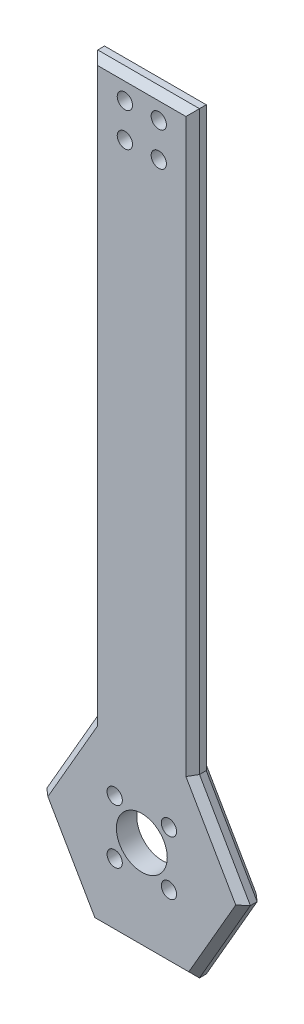
ISO-10303-21;
HEADER;
FILE_DESCRIPTION(('STEP AP214'),'2;1');
FILE_NAME('part.step','',(''),(''),'','','');
FILE_SCHEMA(('AUTOMOTIVE_DESIGN { 1 0 10303 214 1 1 1 1 }'));
ENDSEC;
DATA;
#1=APPLICATION_CONTEXT('core data for automotive mechanical design processes');
#2=APPLICATION_PROTOCOL_DEFINITION('international standard','automotive_design',2000,#1);
#3=PRODUCT_CONTEXT('',#1,'mechanical');
#4=PRODUCT('Part','Part','',(#3));
#5=PRODUCT_RELATED_PRODUCT_CATEGORY('part','',(#4));
#6=PRODUCT_DEFINITION_FORMATION('','',#4);
#7=PRODUCT_DEFINITION_CONTEXT('part definition',#1,'design');
#8=PRODUCT_DEFINITION('design','',#6,#7);
#9=PRODUCT_DEFINITION_SHAPE('','',#8);
#10=(LENGTH_UNIT() NAMED_UNIT(*) SI_UNIT(.MILLI.,.METRE.));
#11=(NAMED_UNIT(*) PLANE_ANGLE_UNIT() SI_UNIT($,.RADIAN.));
#12=(NAMED_UNIT(*) SI_UNIT($,.STERADIAN.) SOLID_ANGLE_UNIT());
#13=UNCERTAINTY_MEASURE_WITH_UNIT(LENGTH_MEASURE(1.E-05),#10,'distance_accuracy_value','');
#14=(GEOMETRIC_REPRESENTATION_CONTEXT(3) GLOBAL_UNCERTAINTY_ASSIGNED_CONTEXT((#13)) GLOBAL_UNIT_ASSIGNED_CONTEXT((#10,
#11,#12)) REPRESENTATION_CONTEXT('',''));
#15=CARTESIAN_POINT('',(0.,0.,0.));
#16=DIRECTION('',(0.,0.,1.));
#17=DIRECTION('',(1.,0.,0.));
#18=AXIS2_PLACEMENT_3D('',#15,#16,#17);
#19=CARTESIAN_POINT('',(0.,0.,0.));
#20=DIRECTION('',(0.,0.,-1.));
#21=DIRECTION('',(-1.,0.,0.));
#22=AXIS2_PLACEMENT_3D('',#19,#20,#21);
#23=PLANE('',#22);
#24=DIRECTION('',(0.5,0.866025403784439,0.));
#25=VECTOR('',#24,1.);
#26=CARTESIAN_POINT('',(27.2881304684075,-15.7548094716167,0.));
#27=LINE('',#26,#25);
#28=CARTESIAN_POINT('',(-27.6905989232415,-110.980762113533,0.));
#29=VERTEX_POINT('',#28);
#30=CARTESIAN_POINT('',(-13.,-85.5358983848622,0.));
#31=VERTEX_POINT('',#30);
#32=EDGE_CURVE('E214',#29,#31,#27,.T.);
#33=ORIENTED_EDGE('',*,*,#32,.T.);
#34=DIRECTION('',(0.,1.,0.));
#35=VECTOR('',#34,1.);
#36=CARTESIAN_POINT('',(-13.,85.,0.));
#37=LINE('',#36,#35);
#38=CARTESIAN_POINT('',(-13.,83.,0.));
#39=VERTEX_POINT('',#38);
#40=EDGE_CURVE('E169',#31,#39,#37,.T.);
#41=ORIENTED_EDGE('',*,*,#40,.T.);
#42=DIRECTION('',(1.,0.,0.));
#43=VECTOR('',#42,1.);
#44=CARTESIAN_POINT('',(15.,83.,0.));
#45=LINE('',#44,#43);
#46=CARTESIAN_POINT('',(13.,83.,0.));
#47=VERTEX_POINT('',#46);
#48=EDGE_CURVE('E199',#39,#47,#45,.T.);
#49=ORIENTED_EDGE('',*,*,#48,.T.);
#50=DIRECTION('',(0.,-1.,0.));
#51=VECTOR('',#50,1.);
#52=CARTESIAN_POINT('',(13.,-85.,0.));
#53=LINE('',#52,#51);
#54=CARTESIAN_POINT('',(13.,-85.5358983848623,0.));
#55=VERTEX_POINT('',#54);
#56=EDGE_CURVE('E204',#47,#55,#53,.T.);
#57=ORIENTED_EDGE('',*,*,#56,.T.);
#58=DIRECTION('',(0.5,-0.866025403784439,0.));
#59=VECTOR('',#58,1.);
#60=CARTESIAN_POINT('',(-27.2881304684075,-15.7548094716167,0.));
#61=LINE('',#60,#59);
#62=CARTESIAN_POINT('',(27.6905989232415,-110.980762113533,0.));
#63=VERTEX_POINT('',#62);
#64=EDGE_CURVE('E206',#55,#63,#61,.T.);
#65=ORIENTED_EDGE('',*,*,#64,.T.);
#66=DIRECTION('',(-0.5,-0.866025403784439,0.));
#67=VECTOR('',#66,1.);
#68=CARTESIAN_POINT('',(68.8240288532697,-39.7355715851498,0.));
#69=LINE('',#68,#67);
#70=CARTESIAN_POINT('',(13.8452994616207,-134.961524227066,0.));
#71=VERTEX_POINT('',#70);
#72=EDGE_CURVE('E208',#63,#71,#69,.T.);
#73=ORIENTED_EDGE('',*,*,#72,.T.);
#74=DIRECTION('',(-1.,0.,0.));
#75=VECTOR('',#74,1.);
#76=CARTESIAN_POINT('',(0.,-134.961524227066,0.));
#77=LINE('',#76,#75);
#78=CARTESIAN_POINT('',(-13.8452994616208,-134.961524227066,0.));
#79=VERTEX_POINT('',#78);
#80=EDGE_CURVE('E210',#71,#79,#77,.T.);
#81=ORIENTED_EDGE('',*,*,#80,.T.);
#82=DIRECTION('',(-0.5,0.866025403784439,0.));
#83=VECTOR('',#82,1.);
#84=CARTESIAN_POINT('',(-68.8240288532698,-39.7355715851499,0.));
#85=LINE('',#84,#83);
#86=EDGE_CURVE('E212',#79,#29,#85,.T.);
#87=ORIENTED_EDGE('',*,*,#86,.T.);
#88=EDGE_LOOP('',(#33,#41,#49,#57,#65,#73,#81,#87));
#89=FACE_BOUND('',#88,.T.);
#90=CARTESIAN_POINT('',(-8.,-100.961524227066,0.));
#91=DIRECTION('',(0.,0.,-1.));
#92=DIRECTION('',(-1.,0.,0.));
#93=AXIS2_PLACEMENT_3D('',#90,#91,#92);
#94=CIRCLE('',#93,2.25000000000001);
#95=CARTESIAN_POINT('',(-10.25,-100.961524227066,0.));
#96=VERTEX_POINT('',#95);
#97=EDGE_CURVE('E752',#96,#96,#94,.T.);
#98=ORIENTED_EDGE('',*,*,#97,.F.);
#99=EDGE_LOOP('',(#98));
#100=FACE_BOUND('',#99,.T.);
#101=CARTESIAN_POINT('',(8.,-100.961524227066,0.));
#102=DIRECTION('',(0.,0.,-1.));
#103=DIRECTION('',(-1.,0.,0.));
#104=AXIS2_PLACEMENT_3D('',#101,#102,#103);
#105=CIRCLE('',#104,2.25000000000001);
#106=CARTESIAN_POINT('',(5.74999999999998,-100.961524227066,0.));
#107=VERTEX_POINT('',#106);
#108=EDGE_CURVE('E746',#107,#107,#105,.T.);
#109=ORIENTED_EDGE('',*,*,#108,.F.);
#110=EDGE_LOOP('',(#109));
#111=FACE_BOUND('',#110,.T.);
#112=CARTESIAN_POINT('',(8.,-116.961524227066,0.));
#113=DIRECTION('',(0.,0.,-1.));
#114=DIRECTION('',(-1.,0.,0.));
#115=AXIS2_PLACEMENT_3D('',#112,#113,#114);
#116=CIRCLE('',#115,2.25000000000001);
#117=CARTESIAN_POINT('',(5.74999999999998,-116.961524227066,0.));
#118=VERTEX_POINT('',#117);
#119=EDGE_CURVE('E740',#118,#118,#116,.T.);
#120=ORIENTED_EDGE('',*,*,#119,.F.);
#121=EDGE_LOOP('',(#120));
#122=FACE_BOUND('',#121,.T.);
#123=CARTESIAN_POINT('',(-8.,-116.961524227066,0.));
#124=DIRECTION('',(0.,0.,-1.));
#125=DIRECTION('',(-1.,0.,0.));
#126=AXIS2_PLACEMENT_3D('',#123,#124,#125);
#127=CIRCLE('',#126,2.25000000000001);
#128=CARTESIAN_POINT('',(-10.25,-116.961524227066,0.));
#129=VERTEX_POINT('',#128);
#130=EDGE_CURVE('E734',#129,#129,#127,.T.);
#131=ORIENTED_EDGE('',*,*,#130,.F.);
#132=EDGE_LOOP('',(#131));
#133=FACE_BOUND('',#132,.T.);
#134=CARTESIAN_POINT('',(-5.,78.,0.));
#135=DIRECTION('',(0.,0.,1.));
#136=DIRECTION('',(1.,0.,0.));
#137=AXIS2_PLACEMENT_3D('',#134,#135,#136);
#138=CIRCLE('',#137,2.25000000000001);
#139=CARTESIAN_POINT('',(-2.74999999999999,78.,0.));
#140=VERTEX_POINT('',#139);
#141=EDGE_CURVE('E731',#140,#140,#138,.T.);
#142=ORIENTED_EDGE('',*,*,#141,.T.);
#143=EDGE_LOOP('',(#142));
#144=FACE_BOUND('',#143,.T.);
#145=CARTESIAN_POINT('',(5.,78.,0.));
#146=DIRECTION('',(0.,0.,1.));
#147=DIRECTION('',(1.,0.,0.));
#148=AXIS2_PLACEMENT_3D('',#145,#146,#147);
#149=CIRCLE('',#148,2.25000000000001);
#150=CARTESIAN_POINT('',(7.25000000000001,78.,0.));
#151=VERTEX_POINT('',#150);
#152=EDGE_CURVE('E725',#151,#151,#149,.T.);
#153=ORIENTED_EDGE('',*,*,#152,.T.);
#154=EDGE_LOOP('',(#153));
#155=FACE_BOUND('',#154,.T.);
#156=CARTESIAN_POINT('',(5.,68.,0.));
#157=DIRECTION('',(0.,0.,1.));
#158=DIRECTION('',(1.,0.,0.));
#159=AXIS2_PLACEMENT_3D('',#156,#157,#158);
#160=CIRCLE('',#159,2.25000000000001);
#161=CARTESIAN_POINT('',(7.25000000000001,68.,0.));
#162=VERTEX_POINT('',#161);
#163=EDGE_CURVE('E719',#162,#162,#160,.T.);
#164=ORIENTED_EDGE('',*,*,#163,.T.);
#165=EDGE_LOOP('',(#164));
#166=FACE_BOUND('',#165,.T.);
#167=CARTESIAN_POINT('',(-5.,68.,0.));
#168=DIRECTION('',(0.,0.,1.));
#169=DIRECTION('',(1.,0.,0.));
#170=AXIS2_PLACEMENT_3D('',#167,#168,#169);
#171=CIRCLE('',#170,2.25000000000001);
#172=CARTESIAN_POINT('',(-2.74999999999999,68.,0.));
#173=VERTEX_POINT('',#172);
#174=EDGE_CURVE('E713',#173,#173,#171,.T.);
#175=ORIENTED_EDGE('',*,*,#174,.T.);
#176=EDGE_LOOP('',(#175));
#177=FACE_BOUND('',#176,.T.);
#178=CARTESIAN_POINT('',(-1.16226472890446E-13,-108.961524227066,0.));
#179=DIRECTION('',(0.,0.,1.));
#180=DIRECTION('',(1.,0.,0.));
#181=AXIS2_PLACEMENT_3D('',#178,#179,#180);
#182=CIRCLE('',#181,7.50000000000001);
#183=CARTESIAN_POINT('',(7.4999999999999,-108.961524227066,0.));
#184=VERTEX_POINT('',#183);
#185=EDGE_CURVE('E704',#184,#184,#182,.T.);
#186=ORIENTED_EDGE('',*,*,#185,.T.);
#187=EDGE_LOOP('',(#186));
#188=FACE_BOUND('',#187,.T.);
#189=ADVANCED_FACE('F43',(#89,#100,#111,#122,#133,#144,#155,#166,#177,#188),#23,.T.);
#190=CARTESIAN_POINT('',(15.,85.,6.));
#191=DIRECTION('',(0.,-1.,0.));
#192=DIRECTION('',(0.,0.,-1.));
#193=AXIS2_PLACEMENT_3D('',#190,#191,#192);
#194=PLANE('',#193);
#195=DIRECTION('',(0.,0.,-1.));
#196=VECTOR('',#195,1.);
#197=CARTESIAN_POINT('',(15.,85.,6.));
#198=LINE('',#197,#196);
#199=CARTESIAN_POINT('',(15.,85.,4.));
#200=VERTEX_POINT('',#199);
#201=CARTESIAN_POINT('',(15.,85.,1.99999999999997));
#202=VERTEX_POINT('',#201);
#203=EDGE_CURVE('E313',#200,#202,#198,.T.);
#204=ORIENTED_EDGE('',*,*,#203,.T.);
#205=DIRECTION('',(-1.,0.,0.));
#206=VECTOR('',#205,1.);
#207=CARTESIAN_POINT('',(-15.,85.,1.99999999999997));
#208=LINE('',#207,#206);
#209=CARTESIAN_POINT('',(-15.,85.,1.99999999999997));
#210=VERTEX_POINT('',#209);
#211=EDGE_CURVE('E242',#202,#210,#208,.T.);
#212=ORIENTED_EDGE('',*,*,#211,.T.);
#213=DIRECTION('',(0.,0.,-1.));
#214=VECTOR('',#213,1.);
#215=CARTESIAN_POINT('',(-15.,85.,6.));
#216=LINE('',#215,#214);
#217=CARTESIAN_POINT('',(-15.,85.,4.));
#218=VERTEX_POINT('',#217);
#219=EDGE_CURVE('E180',#218,#210,#216,.T.);
#220=ORIENTED_EDGE('',*,*,#219,.F.);
#221=DIRECTION('',(1.,0.,0.));
#222=VECTOR('',#221,1.);
#223=CARTESIAN_POINT('',(15.,85.,4.));
#224=LINE('',#223,#222);
#225=EDGE_CURVE('E240',#218,#200,#224,.T.);
#226=ORIENTED_EDGE('',*,*,#225,.T.);
#227=EDGE_LOOP('',(#204,#212,#220,#226));
#228=FACE_BOUND('',#227,.T.);
#229=ADVANCED_FACE('F339',(#228),#194,.F.);
#230=CARTESIAN_POINT('',(-15.,-85.,6.));
#231=DIRECTION('',(1.,0.,0.));
#232=DIRECTION('',(0.,0.,-1.));
#233=AXIS2_PLACEMENT_3D('',#230,#231,#232);
#234=PLANE('',#233);
#235=ORIENTED_EDGE('',*,*,#219,.T.);
#236=DIRECTION('',(0.,-1.,0.));
#237=VECTOR('',#236,1.);
#238=CARTESIAN_POINT('',(-15.,-85.,1.99999999999997));
#239=LINE('',#238,#237);
#240=CARTESIAN_POINT('',(-15.,-85.,1.99999999999997));
#241=VERTEX_POINT('',#240);
#242=EDGE_CURVE('E179',#210,#241,#239,.T.);
#243=ORIENTED_EDGE('',*,*,#242,.T.);
#244=DIRECTION('',(0.,0.,-1.));
#245=VECTOR('',#244,1.);
#246=CARTESIAN_POINT('',(-15.,-85.,6.));
#247=LINE('',#246,#245);
#248=CARTESIAN_POINT('',(-15.,-85.,4.));
#249=VERTEX_POINT('',#248);
#250=EDGE_CURVE('E161',#249,#241,#247,.T.);
#251=ORIENTED_EDGE('',*,*,#250,.F.);
#252=DIRECTION('',(0.,1.,0.));
#253=VECTOR('',#252,1.);
#254=CARTESIAN_POINT('',(-15.,-85.,4.));
#255=LINE('',#254,#253);
#256=EDGE_CURVE('E176',#249,#218,#255,.T.);
#257=ORIENTED_EDGE('',*,*,#256,.T.);
#258=EDGE_LOOP('',(#235,#243,#251,#257));
#259=FACE_BOUND('',#258,.T.);
#260=ADVANCED_FACE('F174',(#259),#234,.F.);
#261=CARTESIAN_POINT('',(15.,-85.,6.));
#262=DIRECTION('',(-1.,0.,0.));
#263=DIRECTION('',(0.,0.,1.));
#264=AXIS2_PLACEMENT_3D('',#261,#262,#263);
#265=PLANE('',#264);
#266=DIRECTION('',(0.,0.,-1.));
#267=VECTOR('',#266,1.);
#268=CARTESIAN_POINT('',(15.,-85.,6.));
#269=LINE('',#268,#267);
#270=CARTESIAN_POINT('',(15.,-85.,4.));
#271=VERTEX_POINT('',#270);
#272=CARTESIAN_POINT('',(15.,-85.,1.99999999999997));
#273=VERTEX_POINT('',#272);
#274=EDGE_CURVE('E181',#271,#273,#269,.T.);
#275=ORIENTED_EDGE('',*,*,#274,.T.);
#276=DIRECTION('',(0.,1.,0.));
#277=VECTOR('',#276,1.);
#278=CARTESIAN_POINT('',(15.,85.,1.99999999999997));
#279=LINE('',#278,#277);
#280=EDGE_CURVE('E238',#273,#202,#279,.T.);
#281=ORIENTED_EDGE('',*,*,#280,.T.);
#282=ORIENTED_EDGE('',*,*,#203,.F.);
#283=DIRECTION('',(0.,-1.,0.));
#284=VECTOR('',#283,1.);
#285=CARTESIAN_POINT('',(15.,-85.,4.));
#286=LINE('',#285,#284);
#287=EDGE_CURVE('E235',#200,#271,#286,.T.);
#288=ORIENTED_EDGE('',*,*,#287,.T.);
#289=EDGE_LOOP('',(#275,#281,#282,#288));
#290=FACE_BOUND('',#289,.T.);
#291=ADVANCED_FACE('F320',(#290),#265,.F.);
#292=CARTESIAN_POINT('',(0.,0.,6.));
#293=DIRECTION('',(0.,0.,-1.));
#294=DIRECTION('',(-1.,0.,0.));
#295=AXIS2_PLACEMENT_3D('',#292,#293,#294);
#296=PLANE('',#295);
#297=CARTESIAN_POINT('',(-1.16226472890446E-13,-108.961524227066,6.));
#298=DIRECTION('',(0.,0.,1.));
#299=DIRECTION('',(1.,0.,0.));
#300=AXIS2_PLACEMENT_3D('',#297,#298,#299);
#301=CIRCLE('',#300,7.50000000000001);
#302=CARTESIAN_POINT('',(7.4999999999999,-108.961524227066,6.));
#303=VERTEX_POINT('',#302);
#304=EDGE_CURVE('E706',#303,#303,#301,.T.);
#305=ORIENTED_EDGE('',*,*,#304,.F.);
#306=EDGE_LOOP('',(#305));
#307=FACE_BOUND('',#306,.T.);
#308=CARTESIAN_POINT('',(-5.,68.,6.));
#309=DIRECTION('',(0.,0.,1.));
#310=DIRECTION('',(1.,0.,0.));
#311=AXIS2_PLACEMENT_3D('',#308,#309,#310);
#312=CIRCLE('',#311,2.25000000000001);
#313=CARTESIAN_POINT('',(-2.74999999999998,68.,6.));
#314=VERTEX_POINT('',#313);
#315=EDGE_CURVE('E708',#314,#314,#312,.T.);
#316=ORIENTED_EDGE('',*,*,#315,.F.);
#317=EDGE_LOOP('',(#316));
#318=FACE_BOUND('',#317,.T.);
#319=CARTESIAN_POINT('',(5.,68.,6.));
#320=DIRECTION('',(0.,0.,1.));
#321=DIRECTION('',(1.,0.,0.));
#322=AXIS2_PLACEMENT_3D('',#319,#320,#321);
#323=CIRCLE('',#322,2.25000000000001);
#324=CARTESIAN_POINT('',(7.25000000000001,68.,6.));
#325=VERTEX_POINT('',#324);
#326=EDGE_CURVE('E716',#325,#325,#323,.T.);
#327=ORIENTED_EDGE('',*,*,#326,.F.);
#328=EDGE_LOOP('',(#327));
#329=FACE_BOUND('',#328,.T.);
#330=CARTESIAN_POINT('',(5.,78.,6.));
#331=DIRECTION('',(0.,0.,1.));
#332=DIRECTION('',(1.,0.,0.));
#333=AXIS2_PLACEMENT_3D('',#330,#331,#332);
#334=CIRCLE('',#333,2.25000000000001);
#335=CARTESIAN_POINT('',(7.25000000000001,78.,6.));
#336=VERTEX_POINT('',#335);
#337=EDGE_CURVE('E722',#336,#336,#334,.T.);
#338=ORIENTED_EDGE('',*,*,#337,.F.);
#339=EDGE_LOOP('',(#338));
#340=FACE_BOUND('',#339,.T.);
#341=CARTESIAN_POINT('',(-5.,78.,6.));
#342=DIRECTION('',(0.,0.,1.));
#343=DIRECTION('',(1.,0.,0.));
#344=AXIS2_PLACEMENT_3D('',#341,#342,#343);
#345=CIRCLE('',#344,2.25000000000001);
#346=CARTESIAN_POINT('',(-2.74999999999998,78.,6.));
#347=VERTEX_POINT('',#346);
#348=EDGE_CURVE('E728',#347,#347,#345,.T.);
#349=ORIENTED_EDGE('',*,*,#348,.F.);
#350=EDGE_LOOP('',(#349));
#351=FACE_BOUND('',#350,.T.);
#352=CARTESIAN_POINT('',(-8.,-116.961524227066,6.));
#353=DIRECTION('',(0.,0.,-1.));
#354=DIRECTION('',(-1.,0.,0.));
#355=AXIS2_PLACEMENT_3D('',#352,#353,#354);
#356=CIRCLE('',#355,2.25000000000001);
#357=CARTESIAN_POINT('',(-10.25,-116.961524227066,6.));
#358=VERTEX_POINT('',#357);
#359=EDGE_CURVE('E737',#358,#358,#356,.T.);
#360=ORIENTED_EDGE('',*,*,#359,.T.);
#361=EDGE_LOOP('',(#360));
#362=FACE_BOUND('',#361,.T.);
#363=CARTESIAN_POINT('',(8.,-116.961524227066,6.));
#364=DIRECTION('',(0.,0.,-1.));
#365=DIRECTION('',(-1.,0.,0.));
#366=AXIS2_PLACEMENT_3D('',#363,#364,#365);
#367=CIRCLE('',#366,2.25000000000001);
#368=CARTESIAN_POINT('',(5.74999999999998,-116.961524227066,6.));
#369=VERTEX_POINT('',#368);
#370=EDGE_CURVE('E743',#369,#369,#367,.T.);
#371=ORIENTED_EDGE('',*,*,#370,.T.);
#372=EDGE_LOOP('',(#371));
#373=FACE_BOUND('',#372,.T.);
#374=CARTESIAN_POINT('',(8.,-100.961524227066,6.));
#375=DIRECTION('',(0.,0.,-1.));
#376=DIRECTION('',(-1.,0.,0.));
#377=AXIS2_PLACEMENT_3D('',#374,#375,#376);
#378=CIRCLE('',#377,2.25000000000001);
#379=CARTESIAN_POINT('',(5.74999999999998,-100.961524227066,6.));
#380=VERTEX_POINT('',#379);
#381=EDGE_CURVE('E749',#380,#380,#378,.T.);
#382=ORIENTED_EDGE('',*,*,#381,.T.);
#383=EDGE_LOOP('',(#382));
#384=FACE_BOUND('',#383,.T.);
#385=CARTESIAN_POINT('',(-8.,-100.961524227066,6.));
#386=DIRECTION('',(0.,0.,-1.));
#387=DIRECTION('',(-1.,0.,0.));
#388=AXIS2_PLACEMENT_3D('',#385,#386,#387);
#389=CIRCLE('',#388,2.25000000000001);
#390=CARTESIAN_POINT('',(-10.25,-100.961524227066,6.));
#391=VERTEX_POINT('',#390);
#392=EDGE_CURVE('E280',#391,#391,#389,.T.);
#393=ORIENTED_EDGE('',*,*,#392,.T.);
#394=EDGE_LOOP('',(#393));
#395=FACE_BOUND('',#394,.T.);
#396=DIRECTION('',(-0.5,0.866025403784439,0.));
#397=VECTOR('',#396,1.);
#398=CARTESIAN_POINT('',(13.2679491924311,-86.,6.));
#399=LINE('',#398,#397);
#400=CARTESIAN_POINT('',(27.6905989232415,-110.980762113533,6.));
#401=VERTEX_POINT('',#400);
#402=CARTESIAN_POINT('',(13.,-85.5358983848623,6.));
#403=VERTEX_POINT('',#402);
#404=EDGE_CURVE('E53',#401,#403,#399,.T.);
#405=ORIENTED_EDGE('',*,*,#404,.T.);
#406=DIRECTION('',(0.,1.,0.));
#407=VECTOR('',#406,1.);
#408=CARTESIAN_POINT('',(13.,0.,6.));
#409=LINE('',#408,#407);
#410=CARTESIAN_POINT('',(13.,83.,6.));
#411=VERTEX_POINT('',#410);
#412=EDGE_CURVE('E11',#403,#411,#409,.T.);
#413=ORIENTED_EDGE('',*,*,#412,.T.);
#414=DIRECTION('',(-1.,0.,0.));
#415=VECTOR('',#414,1.);
#416=CARTESIAN_POINT('',(0.,83.,6.));
#417=LINE('',#416,#415);
#418=CARTESIAN_POINT('',(-13.,83.,6.));
#419=VERTEX_POINT('',#418);
#420=EDGE_CURVE('E244',#411,#419,#417,.T.);
#421=ORIENTED_EDGE('',*,*,#420,.T.);
#422=DIRECTION('',(0.,-1.,0.));
#423=VECTOR('',#422,1.);
#424=CARTESIAN_POINT('',(-13.,0.,6.));
#425=LINE('',#424,#423);
#426=CARTESIAN_POINT('',(-13.,-85.5358983848622,6.));
#427=VERTEX_POINT('',#426);
#428=EDGE_CURVE('E246',#419,#427,#425,.T.);
#429=ORIENTED_EDGE('',*,*,#428,.T.);
#430=DIRECTION('',(-0.5,-0.866025403784439,0.));
#431=VECTOR('',#430,1.);
#432=CARTESIAN_POINT('',(-28.2679491924311,-111.980762113533,6.));
#433=LINE('',#432,#431);
#434=CARTESIAN_POINT('',(-27.6905989232415,-110.980762113533,6.));
#435=VERTEX_POINT('',#434);
#436=EDGE_CURVE('E187',#427,#435,#433,.T.);
#437=ORIENTED_EDGE('',*,*,#436,.T.);
#438=DIRECTION('',(0.5,-0.866025403784439,0.));
#439=VECTOR('',#438,1.);
#440=CARTESIAN_POINT('',(-13.2679491924311,-135.961524227066,6.));
#441=LINE('',#440,#439);
#442=CARTESIAN_POINT('',(-13.8452994616208,-134.961524227066,6.));
#443=VERTEX_POINT('',#442);
#444=EDGE_CURVE('E249',#435,#443,#441,.T.);
#445=ORIENTED_EDGE('',*,*,#444,.T.);
#446=DIRECTION('',(1.,0.,0.));
#447=VECTOR('',#446,1.);
#448=CARTESIAN_POINT('',(15.,-134.961524227066,6.));
#449=LINE('',#448,#447);
#450=CARTESIAN_POINT('',(13.8452994616208,-134.961524227066,6.));
#451=VERTEX_POINT('',#450);
#452=EDGE_CURVE('E251',#443,#451,#449,.T.);
#453=ORIENTED_EDGE('',*,*,#452,.T.);
#454=DIRECTION('',(0.5,0.866025403784439,0.));
#455=VECTOR('',#454,1.);
#456=CARTESIAN_POINT('',(28.2679491924311,-109.980762113533,6.));
#457=LINE('',#456,#455);
#458=EDGE_CURVE('E64',#451,#401,#457,.T.);
#459=ORIENTED_EDGE('',*,*,#458,.T.);
#460=EDGE_LOOP('',(#405,#413,#421,#429,#437,#445,#453,#459));
#461=FACE_BOUND('',#460,.T.);
#462=ADVANCED_FACE('F348',(#307,#318,#329,#340,#351,#362,#373,#384,#395,#461),#296,.F.);
#463=CARTESIAN_POINT('',(-15.,-85.,0.));
#464=DIRECTION('',(-0.866025403784439,0.5,0.));
#465=DIRECTION('',(-0.5,-0.866025403784439,0.));
#466=AXIS2_PLACEMENT_3D('',#463,#464,#465);
#467=PLANE('',#466);
#468=ORIENTED_EDGE('',*,*,#250,.T.);
#469=DIRECTION('',(-0.5,-0.866025403784439,0.));
#470=VECTOR('',#469,1.);
#471=CARTESIAN_POINT('',(-15.,-85.,1.99999999999997));
#472=LINE('',#471,#470);
#473=CARTESIAN_POINT('',(-30.,-110.980762113533,1.99999999999997));
#474=VERTEX_POINT('',#473);
#475=EDGE_CURVE('E168',#241,#474,#472,.T.);
#476=ORIENTED_EDGE('',*,*,#475,.T.);
#477=DIRECTION('',(0.,0.,1.));
#478=VECTOR('',#477,1.);
#479=CARTESIAN_POINT('',(-30.,-110.980762113533,0.));
#480=LINE('',#479,#478);
#481=CARTESIAN_POINT('',(-30.,-110.980762113533,3.99999999999999));
#482=VERTEX_POINT('',#481);
#483=EDGE_CURVE('E163',#474,#482,#480,.T.);
#484=ORIENTED_EDGE('',*,*,#483,.T.);
#485=DIRECTION('',(0.5,0.866025403784439,0.));
#486=VECTOR('',#485,1.);
#487=CARTESIAN_POINT('',(-15.,-85.,3.99999999999999));
#488=LINE('',#487,#486);
#489=EDGE_CURVE('E158',#482,#249,#488,.T.);
#490=ORIENTED_EDGE('',*,*,#489,.T.);
#491=EDGE_LOOP('',(#468,#476,#484,#490));
#492=FACE_BOUND('',#491,.T.);
#493=ADVANCED_FACE('F160',(#492),#467,.T.);
#494=CARTESIAN_POINT('',(30.,-110.980762113533,0.));
#495=DIRECTION('',(0.866025403784439,0.5,0.));
#496=DIRECTION('',(-0.5,0.866025403784439,0.));
#497=AXIS2_PLACEMENT_3D('',#494,#495,#496);
#498=PLANE('',#497);
#499=DIRECTION('',(0.,0.,1.));
#500=VECTOR('',#499,1.);
#501=CARTESIAN_POINT('',(30.,-110.980762113533,0.));
#502=LINE('',#501,#500);
#503=CARTESIAN_POINT('',(30.,-110.980762113533,1.99999999999997));
#504=VERTEX_POINT('',#503);
#505=CARTESIAN_POINT('',(30.,-110.980762113533,4.00000000000001));
#506=VERTEX_POINT('',#505);
#507=EDGE_CURVE('E308',#504,#506,#502,.T.);
#508=ORIENTED_EDGE('',*,*,#507,.F.);
#509=DIRECTION('',(-0.5,0.866025403784439,0.));
#510=VECTOR('',#509,1.);
#511=CARTESIAN_POINT('',(30.,-110.980762113533,1.99999999999997));
#512=LINE('',#511,#510);
#513=EDGE_CURVE('E233',#504,#273,#512,.T.);
#514=ORIENTED_EDGE('',*,*,#513,.T.);
#515=ORIENTED_EDGE('',*,*,#274,.F.);
#516=DIRECTION('',(0.5,-0.866025403784439,0.));
#517=VECTOR('',#516,1.);
#518=CARTESIAN_POINT('',(30.,-110.980762113533,4.));
#519=LINE('',#518,#517);
#520=EDGE_CURVE('E231',#271,#506,#519,.T.);
#521=ORIENTED_EDGE('',*,*,#520,.T.);
#522=EDGE_LOOP('',(#508,#514,#515,#521));
#523=FACE_BOUND('',#522,.T.);
#524=ADVANCED_FACE('F357',(#523),#498,.T.);
#525=CARTESIAN_POINT('',(15.,-136.961524227066,0.));
#526=DIRECTION('',(0.866025403784439,-0.5,0.));
#527=DIRECTION('',(0.5,0.866025403784439,0.));
#528=AXIS2_PLACEMENT_3D('',#525,#526,#527);
#529=PLANE('',#528);
#530=DIRECTION('',(0.,0.,1.));
#531=VECTOR('',#530,1.);
#532=CARTESIAN_POINT('',(15.,-136.961524227066,0.));
#533=LINE('',#532,#531);
#534=CARTESIAN_POINT('',(15.,-136.961524227066,1.99999999999997));
#535=VERTEX_POINT('',#534);
#536=CARTESIAN_POINT('',(15.,-136.961524227066,4.));
#537=VERTEX_POINT('',#536);
#538=EDGE_CURVE('E305',#535,#537,#533,.T.);
#539=ORIENTED_EDGE('',*,*,#538,.F.);
#540=DIRECTION('',(0.5,0.866025403784439,0.));
#541=VECTOR('',#540,1.);
#542=CARTESIAN_POINT('',(15.,-136.961524227066,1.99999999999997));
#543=LINE('',#542,#541);
#544=EDGE_CURVE('E229',#535,#504,#543,.T.);
#545=ORIENTED_EDGE('',*,*,#544,.T.);
#546=ORIENTED_EDGE('',*,*,#507,.T.);
#547=DIRECTION('',(-0.5,-0.866025403784439,0.));
#548=VECTOR('',#547,1.);
#549=CARTESIAN_POINT('',(15.,-136.961524227066,4.00000000000001));
#550=LINE('',#549,#548);
#551=EDGE_CURVE('E227',#506,#537,#550,.T.);
#552=ORIENTED_EDGE('',*,*,#551,.T.);
#553=EDGE_LOOP('',(#539,#545,#546,#552));
#554=FACE_BOUND('',#553,.T.);
#555=ADVANCED_FACE('F522',(#554),#529,.T.);
#556=CARTESIAN_POINT('',(-15.,-136.961524227066,0.));
#557=DIRECTION('',(0.,-1.,0.));
#558=DIRECTION('',(0.,0.,-1.));
#559=AXIS2_PLACEMENT_3D('',#556,#557,#558);
#560=PLANE('',#559);
#561=DIRECTION('',(0.,0.,1.));
#562=VECTOR('',#561,1.);
#563=CARTESIAN_POINT('',(-15.,-136.961524227066,0.));
#564=LINE('',#563,#562);
#565=CARTESIAN_POINT('',(-15.,-136.961524227066,1.99999999999997));
#566=VERTEX_POINT('',#565);
#567=CARTESIAN_POINT('',(-15.,-136.961524227066,4.));
#568=VERTEX_POINT('',#567);
#569=EDGE_CURVE('E302',#566,#568,#564,.T.);
#570=ORIENTED_EDGE('',*,*,#569,.F.);
#571=DIRECTION('',(1.,0.,0.));
#572=VECTOR('',#571,1.);
#573=CARTESIAN_POINT('',(-15.,-136.961524227066,1.99999999999997));
#574=LINE('',#573,#572);
#575=EDGE_CURVE('E225',#566,#535,#574,.T.);
#576=ORIENTED_EDGE('',*,*,#575,.T.);
#577=ORIENTED_EDGE('',*,*,#538,.T.);
#578=DIRECTION('',(-1.,0.,0.));
#579=VECTOR('',#578,1.);
#580=CARTESIAN_POINT('',(-15.,-136.961524227066,4.));
#581=LINE('',#580,#579);
#582=EDGE_CURVE('E223',#537,#568,#581,.T.);
#583=ORIENTED_EDGE('',*,*,#582,.T.);
#584=EDGE_LOOP('',(#570,#576,#577,#583));
#585=FACE_BOUND('',#584,.T.);
#586=ADVANCED_FACE('F514',(#585),#560,.T.);
#587=CARTESIAN_POINT('',(-30.,-110.980762113533,0.));
#588=DIRECTION('',(-0.866025403784439,-0.5,0.));
#589=DIRECTION('',(0.5,-0.866025403784439,0.));
#590=AXIS2_PLACEMENT_3D('',#587,#588,#589);
#591=PLANE('',#590);
#592=ORIENTED_EDGE('',*,*,#483,.F.);
#593=DIRECTION('',(0.5,-0.866025403784439,0.));
#594=VECTOR('',#593,1.);
#595=CARTESIAN_POINT('',(-30.,-110.980762113533,1.99999999999997));
#596=LINE('',#595,#594);
#597=EDGE_CURVE('E221',#474,#566,#596,.T.);
#598=ORIENTED_EDGE('',*,*,#597,.T.);
#599=ORIENTED_EDGE('',*,*,#569,.T.);
#600=DIRECTION('',(-0.5,0.866025403784439,0.));
#601=VECTOR('',#600,1.);
#602=CARTESIAN_POINT('',(-30.,-110.980762113533,4.));
#603=LINE('',#602,#601);
#604=EDGE_CURVE('E219',#568,#482,#603,.T.);
#605=ORIENTED_EDGE('',*,*,#604,.T.);
#606=EDGE_LOOP('',(#592,#598,#599,#605));
#607=FACE_BOUND('',#606,.T.);
#608=ADVANCED_FACE('F299',(#607),#591,.T.);
#609=CARTESIAN_POINT('',(15.,-136.961524227066,1.99999999999997));
#610=DIRECTION('',(-0.61237243569579,0.353553390593271,0.707106781186552));
#611=DIRECTION('',(0.5,0.866025403784439,0.));
#612=AXIS2_PLACEMENT_3D('',#609,#610,#611);
#613=PLANE('',#612);
#614=DIRECTION('',(-0.37796447300923,0.654653670707981,-0.654653670707972));
#615=VECTOR('',#614,1.);
#616=CARTESIAN_POINT('',(15.,-136.961524227066,1.99999999999997));
#617=LINE('',#616,#615);
#618=EDGE_CURVE('E271',#71,#535,#617,.F.);
#619=ORIENTED_EDGE('',*,*,#618,.F.);
#620=ORIENTED_EDGE('',*,*,#72,.F.);
#621=DIRECTION('',(-0.755928946018459,0.,-0.654653670707972));
#622=VECTOR('',#621,1.);
#623=CARTESIAN_POINT('',(30.,-110.980762113533,1.99999999999997));
#624=LINE('',#623,#622);
#625=EDGE_CURVE('E274',#504,#63,#624,.T.);
#626=ORIENTED_EDGE('',*,*,#625,.F.);
#627=ORIENTED_EDGE('',*,*,#544,.F.);
#628=EDGE_LOOP('',(#619,#620,#626,#627));
#629=FACE_BOUND('',#628,.T.);
#630=ADVANCED_FACE('F418',(#629),#613,.F.);
#631=CARTESIAN_POINT('',(30.,-110.980762113533,1.99999999999997));
#632=DIRECTION('',(-0.61237243569579,-0.353553390593271,0.707106781186552));
#633=DIRECTION('',(-0.5,0.866025403784439,0.));
#634=AXIS2_PLACEMENT_3D('',#631,#632,#633);
#635=PLANE('',#634);
#636=ORIENTED_EDGE('',*,*,#625,.T.);
#637=ORIENTED_EDGE('',*,*,#64,.F.);
#638=DIRECTION('',(0.69474659060687,0.186156787897386,0.694746590606861));
#639=VECTOR('',#638,1.);
#640=CARTESIAN_POINT('',(18.8799538113011,-83.9603695095918,5.87995381130099));
#641=LINE('',#640,#639);
#642=EDGE_CURVE('E268',#273,#55,#641,.F.);
#643=ORIENTED_EDGE('',*,*,#642,.F.);
#644=ORIENTED_EDGE('',*,*,#513,.F.);
#645=EDGE_LOOP('',(#636,#637,#643,#644));
#646=FACE_BOUND('',#645,.T.);
#647=ADVANCED_FACE('F328',(#646),#635,.F.);
#648=CARTESIAN_POINT('',(-15.,-136.961524227066,1.99999999999997));
#649=DIRECTION('',(0.,0.707106781186543,0.707106781186552));
#650=DIRECTION('',(1.,0.,0.));
#651=AXIS2_PLACEMENT_3D('',#648,#649,#650);
#652=PLANE('',#651);
#653=ORIENTED_EDGE('',*,*,#618,.T.);
#654=ORIENTED_EDGE('',*,*,#575,.F.);
#655=DIRECTION('',(0.377964473009223,0.654653670707983,-0.654653670707974));
#656=VECTOR('',#655,1.);
#657=CARTESIAN_POINT('',(-15.,-136.961524227066,1.99999999999997));
#658=LINE('',#657,#656);
#659=EDGE_CURVE('E265',#79,#566,#658,.F.);
#660=ORIENTED_EDGE('',*,*,#659,.F.);
#661=ORIENTED_EDGE('',*,*,#80,.F.);
#662=EDGE_LOOP('',(#653,#654,#660,#661));
#663=FACE_BOUND('',#662,.T.);
#664=ADVANCED_FACE('F406',(#663),#652,.F.);
#665=CARTESIAN_POINT('',(15.,-85.,1.99999999999997));
#666=DIRECTION('',(0.707106781186543,0.,-0.707106781186552));
#667=DIRECTION('',(0.,-1.,0.));
#668=AXIS2_PLACEMENT_3D('',#665,#666,#667);
#669=PLANE('',#668);
#670=ORIENTED_EDGE('',*,*,#642,.T.);
#671=ORIENTED_EDGE('',*,*,#56,.F.);
#672=DIRECTION('',(-0.577350269189628,-0.577350269189628,-0.57735026918962));
#673=VECTOR('',#672,1.);
#674=CARTESIAN_POINT('',(15.,85.,1.99999999999997));
#675=LINE('',#674,#673);
#676=EDGE_CURVE('E262',#202,#47,#675,.T.);
#677=ORIENTED_EDGE('',*,*,#676,.F.);
#678=ORIENTED_EDGE('',*,*,#280,.F.);
#679=EDGE_LOOP('',(#670,#671,#677,#678));
#680=FACE_BOUND('',#679,.T.);
#681=ADVANCED_FACE('F332',(#680),#669,.T.);
#682=CARTESIAN_POINT('',(-30.,-110.980762113533,1.99999999999997));
#683=DIRECTION('',(0.612372435695793,0.353553390593273,0.707106781186549));
#684=DIRECTION('',(0.5,-0.866025403784439,0.));
#685=AXIS2_PLACEMENT_3D('',#682,#683,#684);
#686=PLANE('',#685);
#687=ORIENTED_EDGE('',*,*,#659,.T.);
#688=ORIENTED_EDGE('',*,*,#597,.F.);
#689=DIRECTION('',(0.755928946018457,0.,-0.654653670707974));
#690=VECTOR('',#689,1.);
#691=CARTESIAN_POINT('',(-30.,-110.980762113533,1.99999999999997));
#692=LINE('',#691,#690);
#693=EDGE_CURVE('E259',#29,#474,#692,.F.);
#694=ORIENTED_EDGE('',*,*,#693,.F.);
#695=ORIENTED_EDGE('',*,*,#86,.F.);
#696=EDGE_LOOP('',(#687,#688,#694,#695));
#697=FACE_BOUND('',#696,.T.);
#698=ADVANCED_FACE('F394',(#697),#686,.F.);
#699=CARTESIAN_POINT('',(15.,85.,1.99999999999997));
#700=DIRECTION('',(0.,0.707106781186543,-0.707106781186552));
#701=DIRECTION('',(1.,0.,0.));
#702=AXIS2_PLACEMENT_3D('',#699,#700,#701);
#703=PLANE('',#702);
#704=ORIENTED_EDGE('',*,*,#676,.T.);
#705=ORIENTED_EDGE('',*,*,#48,.F.);
#706=DIRECTION('',(-0.577350269189628,0.577350269189628,0.57735026918962));
#707=VECTOR('',#706,1.);
#708=CARTESIAN_POINT('',(-4.99999999999991,74.9999999999999,-7.99999999999998));
#709=LINE('',#708,#707);
#710=EDGE_CURVE('E257',#210,#39,#709,.F.);
#711=ORIENTED_EDGE('',*,*,#710,.F.);
#712=ORIENTED_EDGE('',*,*,#211,.F.);
#713=EDGE_LOOP('',(#704,#705,#711,#712));
#714=FACE_BOUND('',#713,.T.);
#715=ADVANCED_FACE('F337',(#714),#703,.T.);
#716=CARTESIAN_POINT('',(-15.,-85.,1.99999999999997));
#717=DIRECTION('',(0.61237243569579,-0.353553390593271,0.707106781186552));
#718=DIRECTION('',(-0.5,-0.866025403784439,0.));
#719=AXIS2_PLACEMENT_3D('',#716,#717,#718);
#720=PLANE('',#719);
#721=ORIENTED_EDGE('',*,*,#693,.T.);
#722=ORIENTED_EDGE('',*,*,#475,.F.);
#723=DIRECTION('',(-0.69474659060687,0.186156787897386,0.694746590606861));
#724=VECTOR('',#723,1.);
#725=CARTESIAN_POINT('',(-15.,-85.,1.99999999999997));
#726=LINE('',#725,#724);
#727=EDGE_CURVE('E255',#31,#241,#726,.T.);
#728=ORIENTED_EDGE('',*,*,#727,.F.);
#729=ORIENTED_EDGE('',*,*,#32,.F.);
#730=EDGE_LOOP('',(#721,#722,#728,#729));
#731=FACE_BOUND('',#730,.T.);
#732=ADVANCED_FACE('F381',(#731),#720,.F.);
#733=CARTESIAN_POINT('',(-15.,-85.,1.99999999999997));
#734=DIRECTION('',(-0.707106781186543,0.,-0.707106781186552));
#735=DIRECTION('',(0.,1.,0.));
#736=AXIS2_PLACEMENT_3D('',#733,#734,#735);
#737=PLANE('',#736);
#738=ORIENTED_EDGE('',*,*,#710,.T.);
#739=ORIENTED_EDGE('',*,*,#40,.F.);
#740=ORIENTED_EDGE('',*,*,#727,.T.);
#741=ORIENTED_EDGE('',*,*,#242,.F.);
#742=EDGE_LOOP('',(#738,#739,#740,#741));
#743=FACE_BOUND('',#742,.T.);
#744=ADVANCED_FACE('F375',(#743),#737,.T.);
#745=CARTESIAN_POINT('',(-68.8240288532698,-39.7355715851499,6.));
#746=DIRECTION('',(-0.612372435695798,-0.353553390593276,0.707106781186544));
#747=DIRECTION('',(-0.5,0.866025403784439,0.));
#748=AXIS2_PLACEMENT_3D('',#745,#746,#747);
#749=PLANE('',#748);
#750=DIRECTION('',(0.755928946018453,0.,0.654653670707979));
#751=VECTOR('',#750,1.);
#752=CARTESIAN_POINT('',(3.72581787198589,-110.980762113533,33.2074150405471));
#753=LINE('',#752,#751);
#754=EDGE_CURVE('E286',#482,#435,#753,.T.);
#755=ORIENTED_EDGE('',*,*,#754,.F.);
#756=ORIENTED_EDGE('',*,*,#604,.F.);
#757=DIRECTION('',(0.37796447300922,0.654653670707979,0.654653670707979));
#758=VECTOR('',#757,1.);
#759=CARTESIAN_POINT('',(1.86290893599314,-107.754109186518,33.207415040548));
#760=LINE('',#759,#758);
#761=EDGE_CURVE('E48',#443,#568,#760,.F.);
#762=ORIENTED_EDGE('',*,*,#761,.F.);
#763=ORIENTED_EDGE('',*,*,#444,.F.);
#764=EDGE_LOOP('',(#755,#756,#762,#763));
#765=FACE_BOUND('',#764,.T.);
#766=ADVANCED_FACE('F46',(#765),#749,.T.);
#767=CARTESIAN_POINT('',(0.,-134.961524227066,6.));
#768=DIRECTION('',(0.,-0.707106781186547,0.707106781186547));
#769=DIRECTION('',(-1.,0.,0.));
#770=AXIS2_PLACEMENT_3D('',#767,#768,#769);
#771=PLANE('',#770);
#772=ORIENTED_EDGE('',*,*,#761,.T.);
#773=ORIENTED_EDGE('',*,*,#582,.F.);
#774=DIRECTION('',(-0.377964473009227,0.654653670707977,0.654653670707977));
#775=VECTOR('',#774,1.);
#776=CARTESIAN_POINT('',(11.8673995385321,-131.53570106799,9.42582315907616));
#777=LINE('',#776,#775);
#778=EDGE_CURVE('E190',#451,#537,#777,.F.);
#779=ORIENTED_EDGE('',*,*,#778,.F.);
#780=ORIENTED_EDGE('',*,*,#452,.F.);
#781=EDGE_LOOP('',(#772,#773,#779,#780));
#782=FACE_BOUND('',#781,.T.);
#783=ADVANCED_FACE('F292',(#782),#771,.T.);
#784=CARTESIAN_POINT('',(27.2881304684075,-15.7548094716167,6.));
#785=DIRECTION('',(-0.612372435695795,0.353553390593273,0.707106781186547));
#786=DIRECTION('',(0.5,0.866025403784439,0.));
#787=AXIS2_PLACEMENT_3D('',#784,#785,#786);
#788=PLANE('',#787);
#789=ORIENTED_EDGE('',*,*,#754,.T.);
#790=ORIENTED_EDGE('',*,*,#436,.F.);
#791=DIRECTION('',(-0.694746590606866,0.186156787897385,-0.694746590606866));
#792=VECTOR('',#791,1.);
#793=CARTESIAN_POINT('',(-2.57892764259397,-88.3282163072955,16.421072357406));
#794=LINE('',#793,#792);
#795=EDGE_CURVE('E185',#249,#427,#794,.F.);
#796=ORIENTED_EDGE('',*,*,#795,.F.);
#797=ORIENTED_EDGE('',*,*,#489,.F.);
#798=EDGE_LOOP('',(#789,#790,#796,#797));
#799=FACE_BOUND('',#798,.T.);
#800=ADVANCED_FACE('F186',(#799),#788,.T.);
#801=CARTESIAN_POINT('',(68.8240288532697,-39.7355715851498,6.));
#802=DIRECTION('',(0.612372435695795,-0.353553390593274,0.707106781186547));
#803=DIRECTION('',(-0.5,-0.866025403784439,0.));
#804=AXIS2_PLACEMENT_3D('',#801,#802,#803);
#805=PLANE('',#804);
#806=ORIENTED_EDGE('',*,*,#778,.T.);
#807=ORIENTED_EDGE('',*,*,#551,.F.);
#808=DIRECTION('',(-0.755928946018454,0.,0.654653670707977));
#809=VECTOR('',#808,1.);
#810=CARTESIAN_POINT('',(51.1954160261148,-110.980762113533,-14.3557687223952));
#811=LINE('',#810,#809);
#812=EDGE_CURVE('E191',#401,#506,#811,.F.);
#813=ORIENTED_EDGE('',*,*,#812,.F.);
#814=ORIENTED_EDGE('',*,*,#458,.F.);
#815=EDGE_LOOP('',(#806,#807,#813,#814));
#816=FACE_BOUND('',#815,.T.);
#817=ADVANCED_FACE('F448',(#816),#805,.T.);
#818=CARTESIAN_POINT('',(-13.,0.,6.));
#819=DIRECTION('',(0.707106781186547,0.,-0.707106781186547));
#820=DIRECTION('',(0.,-1.,0.));
#821=AXIS2_PLACEMENT_3D('',#818,#819,#820);
#822=PLANE('',#821);
#823=ORIENTED_EDGE('',*,*,#795,.T.);
#824=ORIENTED_EDGE('',*,*,#428,.F.);
#825=DIRECTION('',(0.577350269189626,-0.577350269189626,0.577350269189626));
#826=VECTOR('',#825,1.);
#827=CARTESIAN_POINT('',(-8.66666666666667,78.6666666666667,10.3333333333333));
#828=LINE('',#827,#826);
#829=EDGE_CURVE('E196',#218,#419,#828,.T.);
#830=ORIENTED_EDGE('',*,*,#829,.F.);
#831=ORIENTED_EDGE('',*,*,#256,.F.);
#832=EDGE_LOOP('',(#823,#824,#830,#831));
#833=FACE_BOUND('',#832,.T.);
#834=ADVANCED_FACE('F194',(#833),#822,.F.);
#835=CARTESIAN_POINT('',(-27.2881304684075,-15.7548094716167,6.));
#836=DIRECTION('',(0.612372435695794,0.353553390593274,0.707106781186547));
#837=DIRECTION('',(0.5,-0.866025403784439,0.));
#838=AXIS2_PLACEMENT_3D('',#835,#836,#837);
#839=PLANE('',#838);
#840=ORIENTED_EDGE('',*,*,#812,.T.);
#841=ORIENTED_EDGE('',*,*,#520,.F.);
#842=DIRECTION('',(0.694746590606866,0.186156787897385,-0.694746590606866));
#843=VECTOR('',#842,1.);
#844=CARTESIAN_POINT('',(24.0625111647134,-82.571707452017,-5.06251116471342));
#845=LINE('',#844,#843);
#846=EDGE_CURVE('E279',#403,#271,#845,.T.);
#847=ORIENTED_EDGE('',*,*,#846,.F.);
#848=ORIENTED_EDGE('',*,*,#404,.F.);
#849=EDGE_LOOP('',(#840,#841,#847,#848));
#850=FACE_BOUND('',#849,.T.);
#851=ADVANCED_FACE('F436',(#850),#839,.T.);
#852=CARTESIAN_POINT('',(0.,83.,6.));
#853=DIRECTION('',(0.,-0.707106781186547,-0.707106781186547));
#854=DIRECTION('',(-1.,0.,0.));
#855=AXIS2_PLACEMENT_3D('',#852,#853,#854);
#856=PLANE('',#855);
#857=ORIENTED_EDGE('',*,*,#829,.T.);
#858=ORIENTED_EDGE('',*,*,#420,.F.);
#859=DIRECTION('',(0.577350269189626,0.577350269189626,-0.577350269189626));
#860=VECTOR('',#859,1.);
#861=CARTESIAN_POINT('',(8.66666666666666,78.6666666666667,10.3333333333333));
#862=LINE('',#861,#860);
#863=EDGE_CURVE('E277',#200,#411,#862,.F.);
#864=ORIENTED_EDGE('',*,*,#863,.F.);
#865=ORIENTED_EDGE('',*,*,#225,.F.);
#866=EDGE_LOOP('',(#857,#858,#864,#865));
#867=FACE_BOUND('',#866,.T.);
#868=ADVANCED_FACE('F347',(#867),#856,.F.);
#869=CARTESIAN_POINT('',(13.,0.,6.));
#870=DIRECTION('',(-0.707106781186547,0.,-0.707106781186547));
#871=DIRECTION('',(0.,1.,0.));
#872=AXIS2_PLACEMENT_3D('',#869,#870,#871);
#873=PLANE('',#872);
#874=ORIENTED_EDGE('',*,*,#846,.T.);
#875=ORIENTED_EDGE('',*,*,#287,.F.);
#876=ORIENTED_EDGE('',*,*,#863,.T.);
#877=ORIENTED_EDGE('',*,*,#412,.F.);
#878=EDGE_LOOP('',(#874,#875,#876,#877));
#879=FACE_BOUND('',#878,.T.);
#880=ADVANCED_FACE('F342',(#879),#873,.F.);
#881=CARTESIAN_POINT('',(-8.,-100.961524227066,0.));
#882=DIRECTION('',(0.,0.,-1.));
#883=DIRECTION('',(-1.,0.,0.));
#884=AXIS2_PLACEMENT_3D('',#881,#882,#883);
#885=CYLINDRICAL_SURFACE('',#884,2.25000000000001);
#886=ORIENTED_EDGE('',*,*,#392,.F.);
#887=EDGE_LOOP('',(#886));
#888=FACE_BOUND('',#887,.T.);
#889=ORIENTED_EDGE('',*,*,#97,.T.);
#890=EDGE_LOOP('',(#889));
#891=FACE_BOUND('',#890,.T.);
#892=ADVANCED_FACE('F430',(#888,#891),#885,.F.);
#893=CARTESIAN_POINT('',(8.,-100.961524227066,0.));
#894=DIRECTION('',(0.,0.,-1.));
#895=DIRECTION('',(-1.,0.,0.));
#896=AXIS2_PLACEMENT_3D('',#893,#894,#895);
#897=CYLINDRICAL_SURFACE('',#896,2.25000000000001);
#898=ORIENTED_EDGE('',*,*,#381,.F.);
#899=EDGE_LOOP('',(#898));
#900=FACE_BOUND('',#899,.T.);
#901=ORIENTED_EDGE('',*,*,#108,.T.);
#902=EDGE_LOOP('',(#901));
#903=FACE_BOUND('',#902,.T.);
#904=ADVANCED_FACE('F622',(#900,#903),#897,.F.);
#905=CARTESIAN_POINT('',(8.,-116.961524227066,0.));
#906=DIRECTION('',(0.,0.,-1.));
#907=DIRECTION('',(-1.,0.,0.));
#908=AXIS2_PLACEMENT_3D('',#905,#906,#907);
#909=CYLINDRICAL_SURFACE('',#908,2.25000000000001);
#910=ORIENTED_EDGE('',*,*,#370,.F.);
#911=EDGE_LOOP('',(#910));
#912=FACE_BOUND('',#911,.T.);
#913=ORIENTED_EDGE('',*,*,#119,.T.);
#914=EDGE_LOOP('',(#913));
#915=FACE_BOUND('',#914,.T.);
#916=ADVANCED_FACE('F631',(#912,#915),#909,.F.);
#917=CARTESIAN_POINT('',(-8.,-116.961524227066,0.));
#918=DIRECTION('',(0.,0.,-1.));
#919=DIRECTION('',(-1.,0.,0.));
#920=AXIS2_PLACEMENT_3D('',#917,#918,#919);
#921=CYLINDRICAL_SURFACE('',#920,2.25000000000001);
#922=ORIENTED_EDGE('',*,*,#359,.F.);
#923=EDGE_LOOP('',(#922));
#924=FACE_BOUND('',#923,.T.);
#925=ORIENTED_EDGE('',*,*,#130,.T.);
#926=EDGE_LOOP('',(#925));
#927=FACE_BOUND('',#926,.T.);
#928=ADVANCED_FACE('F640',(#924,#927),#921,.F.);
#929=CARTESIAN_POINT('',(-5.,78.,6.));
#930=DIRECTION('',(0.,0.,1.));
#931=DIRECTION('',(1.,0.,0.));
#932=AXIS2_PLACEMENT_3D('',#929,#930,#931);
#933=CYLINDRICAL_SURFACE('',#932,2.25000000000001);
#934=ORIENTED_EDGE('',*,*,#141,.F.);
#935=EDGE_LOOP('',(#934));
#936=FACE_BOUND('',#935,.T.);
#937=ORIENTED_EDGE('',*,*,#348,.T.);
#938=EDGE_LOOP('',(#937));
#939=FACE_BOUND('',#938,.T.);
#940=ADVANCED_FACE('F649',(#936,#939),#933,.F.);
#941=CARTESIAN_POINT('',(5.,78.,6.));
#942=DIRECTION('',(0.,0.,1.));
#943=DIRECTION('',(1.,0.,0.));
#944=AXIS2_PLACEMENT_3D('',#941,#942,#943);
#945=CYLINDRICAL_SURFACE('',#944,2.25000000000001);
#946=ORIENTED_EDGE('',*,*,#152,.F.);
#947=EDGE_LOOP('',(#946));
#948=FACE_BOUND('',#947,.T.);
#949=ORIENTED_EDGE('',*,*,#337,.T.);
#950=EDGE_LOOP('',(#949));
#951=FACE_BOUND('',#950,.T.);
#952=ADVANCED_FACE('F658',(#948,#951),#945,.F.);
#953=CARTESIAN_POINT('',(5.,68.,6.));
#954=DIRECTION('',(0.,0.,1.));
#955=DIRECTION('',(1.,0.,0.));
#956=AXIS2_PLACEMENT_3D('',#953,#954,#955);
#957=CYLINDRICAL_SURFACE('',#956,2.25000000000001);
#958=ORIENTED_EDGE('',*,*,#163,.F.);
#959=EDGE_LOOP('',(#958));
#960=FACE_BOUND('',#959,.T.);
#961=ORIENTED_EDGE('',*,*,#326,.T.);
#962=EDGE_LOOP('',(#961));
#963=FACE_BOUND('',#962,.T.);
#964=ADVANCED_FACE('F667',(#960,#963),#957,.F.);
#965=CARTESIAN_POINT('',(-5.,68.,6.));
#966=DIRECTION('',(0.,0.,1.));
#967=DIRECTION('',(1.,0.,0.));
#968=AXIS2_PLACEMENT_3D('',#965,#966,#967);
#969=CYLINDRICAL_SURFACE('',#968,2.25000000000001);
#970=ORIENTED_EDGE('',*,*,#174,.F.);
#971=EDGE_LOOP('',(#970));
#972=FACE_BOUND('',#971,.T.);
#973=ORIENTED_EDGE('',*,*,#315,.T.);
#974=EDGE_LOOP('',(#973));
#975=FACE_BOUND('',#974,.T.);
#976=ADVANCED_FACE('F676',(#972,#975),#969,.F.);
#977=CARTESIAN_POINT('',(-1.16226472890446E-13,-108.961524227066,6.));
#978=DIRECTION('',(0.,0.,1.));
#979=DIRECTION('',(1.,0.,0.));
#980=AXIS2_PLACEMENT_3D('',#977,#978,#979);
#981=CYLINDRICAL_SURFACE('',#980,7.50000000000001);
#982=ORIENTED_EDGE('',*,*,#185,.F.);
#983=EDGE_LOOP('',(#982));
#984=FACE_BOUND('',#983,.T.);
#985=ORIENTED_EDGE('',*,*,#304,.T.);
#986=EDGE_LOOP('',(#985));
#987=FACE_BOUND('',#986,.T.);
#988=ADVANCED_FACE('F683',(#984,#987),#981,.F.);
#989=CLOSED_SHELL('',(#189,#229,#260,#291,#462,#493,#524,#555,#586,#608,#630,#647,#664,#681,
#698,#715,#732,#744,#766,#783,#800,#817,#834,#851,#868,#880,#892,#904,#916,#928,#940,#952,#964,
#976,#988));
#990=MANIFOLD_SOLID_BREP('B2',#989);
#991=ADVANCED_BREP_SHAPE_REPRESENTATION('',(#18,#990),#14);
#992=SHAPE_DEFINITION_REPRESENTATION(#9,#991);
ENDSEC;
END-ISO-10303-21;
